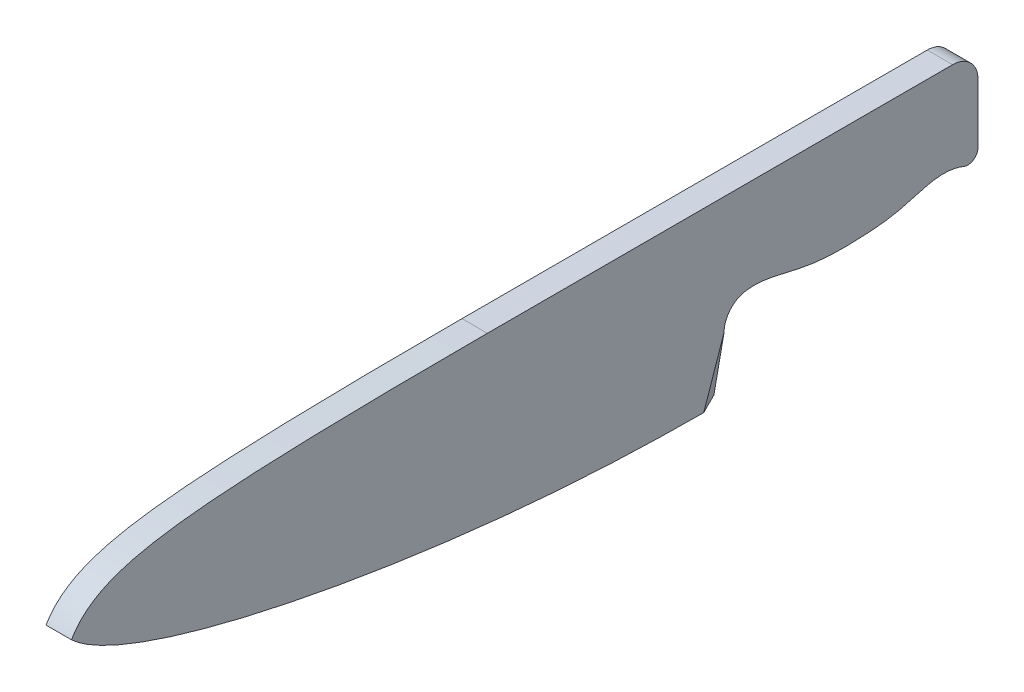
ISO-10303-21;
HEADER;
FILE_DESCRIPTION(('STEP AP214'),'2;1');
FILE_NAME('part.step','',(''),(''),'','','');
FILE_SCHEMA(('AUTOMOTIVE_DESIGN { 1 0 10303 214 1 1 1 1 }'));
ENDSEC;
DATA;
#1=APPLICATION_CONTEXT('core data for automotive mechanical design processes');
#2=APPLICATION_PROTOCOL_DEFINITION('international standard','automotive_design',2000,#1);
#3=PRODUCT_CONTEXT('',#1,'mechanical');
#4=PRODUCT('Part','Part','',(#3));
#5=PRODUCT_RELATED_PRODUCT_CATEGORY('part','',(#4));
#6=PRODUCT_DEFINITION_FORMATION('','',#4);
#7=PRODUCT_DEFINITION_CONTEXT('part definition',#1,'design');
#8=PRODUCT_DEFINITION('design','',#6,#7);
#9=PRODUCT_DEFINITION_SHAPE('','',#8);
#10=(LENGTH_UNIT() NAMED_UNIT(*) SI_UNIT(.MILLI.,.METRE.));
#11=(NAMED_UNIT(*) PLANE_ANGLE_UNIT() SI_UNIT($,.RADIAN.));
#12=(NAMED_UNIT(*) SI_UNIT($,.STERADIAN.) SOLID_ANGLE_UNIT());
#13=UNCERTAINTY_MEASURE_WITH_UNIT(LENGTH_MEASURE(1.E-05),#10,'distance_accuracy_value','');
#14=(GEOMETRIC_REPRESENTATION_CONTEXT(3) GLOBAL_UNCERTAINTY_ASSIGNED_CONTEXT((#13)) GLOBAL_UNIT_ASSIGNED_CONTEXT((#10,
#11,#12)) REPRESENTATION_CONTEXT('',''));
#15=CARTESIAN_POINT('',(0.,0.,0.));
#16=DIRECTION('',(0.,0.,1.));
#17=DIRECTION('',(1.,0.,0.));
#18=AXIS2_PLACEMENT_3D('',#15,#16,#17);
#19=CARTESIAN_POINT('',(0.,0.,0.));
#20=DIRECTION('',(1.,0.,0.));
#21=DIRECTION('',(0.,0.,-1.));
#22=AXIS2_PLACEMENT_3D('',#19,#20,#21);
#23=PLANE('',#22);
#24=DIRECTION('',(0.,0.,-1.));
#25=VECTOR('',#24,1.);
#26=CARTESIAN_POINT('',(0.,-23.2182496890289,0.));
#27=LINE('',#26,#25);
#28=CARTESIAN_POINT('',(0.,-23.2182496890289,-129.97920635635));
#29=VERTEX_POINT('',#28);
#30=CARTESIAN_POINT('',(0.,-23.2182496890289,-130.));
#31=VERTEX_POINT('',#30);
#32=EDGE_CURVE('E133',#29,#31,#27,.T.);
#33=ORIENTED_EDGE('',*,*,#32,.F.);
#34=DIRECTION('',(0.,0.946409710642297,-0.322968511780892));
#35=VECTOR('',#34,1.);
#36=CARTESIAN_POINT('',(0.,-42.151378358654,-123.518152205041));
#37=LINE('',#36,#35);
#38=CARTESIAN_POINT('',(2.74045798044628E-12,-34.8320882912422,-126.015907874488));
#39=VERTEX_POINT('',#38);
#40=EDGE_CURVE('E125',#39,#29,#37,.T.);
#41=ORIENTED_EDGE('',*,*,#40,.F.);
#42=CARTESIAN_POINT('',(0.,-11.3055298771343,-1.49514247137664));
#43=CARTESIAN_POINT('',(0.,-23.9571468302017,-14.8350075186687));
#44=CARTESIAN_POINT('',(0.,-33.8828079248335,-75.5921677527027));
#45=CARTESIAN_POINT('',(0.,-34.8424138846417,-104.343520451848));
#46=CARTESIAN_POINT('',(0.,-34.8424138846417,-130.));
#47=B_SPLINE_CURVE_WITH_KNOTS('',4,(#42,#43,#44,#45,#46),.UNSPECIFIED.,.F.,.F.,(5,5),(0.,1.),.UNSPECIFIED.);
#48=CARTESIAN_POINT('',(0.,-11.3055298771349,-1.49514247137634));
#49=VERTEX_POINT('',#48);
#50=EDGE_CURVE('E167',#49,#39,#47,.T.);
#51=ORIENTED_EDGE('',*,*,#50,.F.);
#52=CARTESIAN_POINT('',(0.,-14.9038464241338,0.));
#53=CARTESIAN_POINT('',(0.,-4.14849373019226,-2.95129566173372));
#54=CARTESIAN_POINT('',(0.,-1.88396672052469,-13.496276671583));
#55=CARTESIAN_POINT('',(0.,0.,-29.5290951403306));
#56=CARTESIAN_POINT('',(0.,0.,-83.4013338124167));
#57=B_SPLINE_CURVE_WITH_KNOTS('',4,(#52,#53,#54,#55,#56),.UNSPECIFIED.,.F.,.F.,(5,5),(0.,1.),.UNSPECIFIED.);
#58=CARTESIAN_POINT('',(0.,0.,-83.4013338124167));
#59=VERTEX_POINT('',#58);
#60=EDGE_CURVE('E175',#49,#59,#57,.T.);
#61=ORIENTED_EDGE('',*,*,#60,.T.);
#62=DIRECTION('',(0.,0.,-1.));
#63=VECTOR('',#62,1.);
#64=CARTESIAN_POINT('',(0.,0.,0.));
#65=LINE('',#64,#63);
#66=CARTESIAN_POINT('',(0.,0.,-175.));
#67=VERTEX_POINT('',#66);
#68=EDGE_CURVE('E340',#59,#67,#65,.T.);
#69=ORIENTED_EDGE('',*,*,#68,.T.);
#70=CARTESIAN_POINT('',(0.,-5.,-175.));
#71=DIRECTION('',(1.,0.,0.));
#72=DIRECTION('',(0.,0.,-1.));
#73=AXIS2_PLACEMENT_3D('',#70,#71,#72);
#74=CIRCLE('',#73,5.);
#75=CARTESIAN_POINT('',(0.,-5.,-180.));
#76=VERTEX_POINT('',#75);
#77=EDGE_CURVE('E233',#67,#76,#74,.F.);
#78=ORIENTED_EDGE('',*,*,#77,.T.);
#79=DIRECTION('',(0.,-1.,0.));
#80=VECTOR('',#79,1.);
#81=CARTESIAN_POINT('',(0.,0.,-180.));
#82=LINE('',#81,#80);
#83=CARTESIAN_POINT('',(0.,-16.6174587646798,-180.));
#84=VERTEX_POINT('',#83);
#85=EDGE_CURVE('E336',#76,#84,#82,.T.);
#86=ORIENTED_EDGE('',*,*,#85,.T.);
#87=CARTESIAN_POINT('',(0.,-16.6174587646798,-178.));
#88=DIRECTION('',(1.,0.,0.));
#89=DIRECTION('',(0.,0.,-1.));
#90=AXIS2_PLACEMENT_3D('',#87,#88,#89);
#91=CIRCLE('',#90,2.);
#92=CARTESIAN_POINT('',(0.,-18.4712177868793,-177.249282018589));
#93=VERTEX_POINT('',#92);
#94=EDGE_CURVE('E215',#84,#93,#91,.F.);
#95=ORIENTED_EDGE('',*,*,#94,.T.);
#96=CARTESIAN_POINT('',(0.,-20.,-130.));
#97=CARTESIAN_POINT('',(0.,-11.053747081909,-142.55496439757));
#98=CARTESIAN_POINT('',(0.,-34.9341755237242,-149.196912903773));
#99=CARTESIAN_POINT('',(0.,-5.37325526441555,-158.630756241077));
#100=CARTESIAN_POINT('',(0.,-33.9367404981705,-163.289648634566));
#101=CARTESIAN_POINT('',(0.,-10.14486839111,-166.072200521993));
#102=CARTESIAN_POINT('',(0.,-20.,-180.));
#103=B_SPLINE_CURVE_WITH_KNOTS('',6,(#96,#97,#98,#99,#100,#101,#102),.UNSPECIFIED.,.F.,.F.,(7,
7),(0.,1.),.UNSPECIFIED.);
#104=CARTESIAN_POINT('',(0.,-18.2291901749905,-134.155272250673));
#105=VERTEX_POINT('',#104);
#106=EDGE_CURVE('E332',#105,#93,#103,.T.);
#107=ORIENTED_EDGE('',*,*,#106,.F.);
#108=CARTESIAN_POINT('',(0.,-23.1573171041104,-135.));
#109=DIRECTION('',(1.,0.,0.));
#110=DIRECTION('',(0.,0.,-1.));
#111=AXIS2_PLACEMENT_3D('',#108,#109,#110);
#112=CIRCLE('',#111,5.);
#113=CARTESIAN_POINT('',(0.,-23.1573171041104,-130.));
#114=VERTEX_POINT('',#113);
#115=EDGE_CURVE('E208',#105,#114,#112,.T.);
#116=ORIENTED_EDGE('',*,*,#115,.T.);
#117=DIRECTION('',(0.,-1.,0.));
#118=VECTOR('',#117,1.);
#119=CARTESIAN_POINT('',(0.,0.,-130.));
#120=LINE('',#119,#118);
#121=EDGE_CURVE('E140',#114,#31,#120,.T.);
#122=ORIENTED_EDGE('',*,*,#121,.T.);
#123=EDGE_LOOP('',(#33,#41,#51,#61,#69,#78,#86,#95,#107,#116,#122));
#124=FACE_BOUND('',#123,.T.);
#125=ADVANCED_FACE('F40',(#124),#23,.F.);
#126=CARTESIAN_POINT('',(5.,0.,-130.));
#127=DIRECTION('',(0.,0.,-1.));
#128=DIRECTION('',(-1.,0.,0.));
#129=AXIS2_PLACEMENT_3D('',#126,#127,#128);
#130=PLANE('',#129);
#131=DIRECTION('',(-0.166223849992716,0.986088044595207,0.));
#132=VECTOR('',#131,1.);
#133=CARTESIAN_POINT('',(-3.65759529527161,-1.45940195659671,-130.));
#134=LINE('',#133,#132);
#135=CARTESIAN_POINT('',(1.96974477587823,-34.8424138846417,-130.));
#136=VERTEX_POINT('',#135);
#137=CARTESIAN_POINT('',(0.00998754232635801,-23.2165660992657,-130.));
#138=VERTEX_POINT('',#137);
#139=EDGE_CURVE('E55',#136,#138,#134,.T.);
#140=ORIENTED_EDGE('',*,*,#139,.T.);
#141=DIRECTION('',(-0.986088044595207,-0.166223849992717,0.));
#142=VECTOR('',#141,1.);
#143=CARTESIAN_POINT('',(8.66758283759797,-21.757164142669,-130.));
#144=LINE('',#143,#142);
#145=EDGE_CURVE('E11',#138,#31,#144,.T.);
#146=ORIENTED_EDGE('',*,*,#145,.T.);
#147=ORIENTED_EDGE('',*,*,#121,.F.);
#148=DIRECTION('',(-1.,0.,0.));
#149=VECTOR('',#148,1.);
#150=CARTESIAN_POINT('',(5.,-23.1573171041104,-130.));
#151=LINE('',#150,#149);
#152=CARTESIAN_POINT('',(4.99999991539885,-23.1573353290078,-129.999996850267));
#153=VERTEX_POINT('',#152);
#154=EDGE_CURVE('E189',#114,#153,#151,.F.);
#155=ORIENTED_EDGE('',*,*,#154,.T.);
#156=DIRECTION('',(0.168722955180373,0.985663514793564,0.));
#157=VECTOR('',#156,1.);
#158=CARTESIAN_POINT('',(8.85115587696016,-0.659229433441154,-130.));
#159=LINE('',#158,#157);
#160=CARTESIAN_POINT('',(2.99977981249231,-34.8424138846417,-130.));
#161=VERTEX_POINT('',#160);
#162=EDGE_CURVE('E141',#161,#153,#159,.T.);
#163=ORIENTED_EDGE('',*,*,#162,.F.);
#164=DIRECTION('',(1.,0.,0.));
#165=VECTOR('',#164,1.);
#166=CARTESIAN_POINT('',(0.,-34.8424138846417,-130.));
#167=LINE('',#166,#165);
#168=EDGE_CURVE('E170',#161,#136,#167,.F.);
#169=ORIENTED_EDGE('',*,*,#168,.T.);
#170=EDGE_LOOP('',(#140,#146,#147,#155,#163,#169));
#171=FACE_BOUND('',#170,.T.);
#172=ADVANCED_FACE('F260',(#171),#130,.T.);
#173=DIRECTION('',(1.,0.,0.));
#174=VECTOR('',#173,1.);
#175=SURFACE_OF_LINEAR_EXTRUSION('',#47,#174);
#176=ORIENTED_EDGE('',*,*,#50,.T.);
#177=CARTESIAN_POINT('',(2.74045798044628E-12,-34.8320882912422,-126.015907874488));
#178=CARTESIAN_POINT('',(0.164278119276692,-34.8339378553204,-126.347846700765));
#179=CARTESIAN_POINT('',(0.32851916686541,-34.8355094181573,-126.679805347657));
#180=CARTESIAN_POINT('',(0.656932642337356,-34.838141982821,-127.343757957752));
#181=CARTESIAN_POINT('',(0.821105070330034,-34.8392029854652,-127.675751920899));
#182=CARTESIAN_POINT('',(1.14938734271228,-34.8408598767794,-128.339771874087));
#183=CARTESIAN_POINT('',(1.31349718710703,-34.8414557654878,-128.671797864125));
#184=CARTESIAN_POINT('',(1.64166117318842,-34.8422330453791,-129.335878527812));
#185=CARTESIAN_POINT('',(1.80571531478545,-34.8424144358982,-129.667933201505));
#186=CARTESIAN_POINT('',(1.96974477587823,-34.8424138846417,-130.));
#187=B_SPLINE_CURVE_WITH_KNOTS('',3,(#177,#178,#179,#180,#181,#182,#183,#184,#185,#186),
.UNSPECIFIED.,.F.,.F.,(4,2,2,2,4),(0.,1.11111048107723,2.22221918309331,3.33332779307961,
4.44443818212724),.UNSPECIFIED.);
#188=EDGE_CURVE('E48',#39,#136,#187,.T.);
#189=ORIENTED_EDGE('',*,*,#188,.T.);
#190=ORIENTED_EDGE('',*,*,#168,.F.);
#191=CARTESIAN_POINT('',(5.03001207199706,-34.8316605732864,-125.939989884659));
#192=CARTESIAN_POINT('',(4.86068610425115,-34.8335885495604,-126.27825063095));
#193=CARTESIAN_POINT('',(4.69139926723171,-34.835226165049,-126.616532538806));
#194=CARTESIAN_POINT('',(4.35289797670323,-34.8379685650899,-127.293134034286));
#195=CARTESIAN_POINT('',(4.18368352307385,-34.8390733505316,-127.631453621845));
#196=CARTESIAN_POINT('',(3.84532057098216,-34.8407979871538,-128.308126932978));
#197=CARTESIAN_POINT('',(3.67617207251408,-34.8414178383768,-128.646480656547));
#198=CARTESIAN_POINT('',(3.33793368095026,-34.8422260850787,-129.323218627831));
#199=CARTESIAN_POINT('',(3.16884378795281,-34.8424144798374,-129.661602875596));
#200=CARTESIAN_POINT('',(2.9997798124923,-34.8424138846417,-130.));
#201=B_SPLINE_CURVE_WITH_KNOTS('',3,(#191,#192,#193,#194,#195,#196,#197,#198,#199,#200),
.UNSPECIFIED.,.F.,.F.,(4,2,2,2,4),(0.,1.1348380953435,2.26967429658376,3.4045103986451,
4.53934839480983),.UNSPECIFIED.);
#202=CARTESIAN_POINT('',(5.,-34.8319991651759,-125.999945765339));
#203=VERTEX_POINT('',#202);
#204=EDGE_CURVE('E180',#203,#161,#201,.T.);
#205=ORIENTED_EDGE('',*,*,#204,.F.);
#206=CARTESIAN_POINT('',(5.,-11.3055435719602,-1.49515691122323));
#207=CARTESIAN_POINT('',(5.,-23.9571548882732,-14.8350568439062));
#208=CARTESIAN_POINT('',(5.,-33.8828084441994,-75.5921833137491));
#209=CARTESIAN_POINT('',(5.,-34.8424138846417,-104.343527394855));
#210=CARTESIAN_POINT('',(5.,-34.8424138846417,-130.));
#211=B_SPLINE_CURVE_WITH_KNOTS('',4,(#206,#207,#208,#209,#210),.UNSPECIFIED.,.F.,.F.,(5,5),
(2.70614164820354E-07,1.),.UNSPECIFIED.);
#212=CARTESIAN_POINT('',(5.00000119031637,-11.3055465844291,-1.49515405418635));
#213=VERTEX_POINT('',#212);
#214=EDGE_CURVE('E172',#213,#203,#211,.T.);
#215=ORIENTED_EDGE('',*,*,#214,.F.);
#216=DIRECTION('',(1.,0.,0.));
#217=VECTOR('',#216,1.);
#218=CARTESIAN_POINT('',(0.,-11.3055298771349,-1.49514247137634));
#219=LINE('',#218,#217);
#220=EDGE_CURVE('E155',#49,#213,#219,.T.);
#221=ORIENTED_EDGE('',*,*,#220,.F.);
#222=EDGE_LOOP('',(#176,#189,#190,#205,#215,#221));
#223=FACE_BOUND('',#222,.T.);
#224=ADVANCED_FACE('F162',(#223),#175,.T.);
#225=CARTESIAN_POINT('',(5.,-14.9038464241338,0.));
#226=CARTESIAN_POINT('',(5.,-4.14849373019226,-2.95129566173372));
#227=CARTESIAN_POINT('',(5.,-1.88396672052469,-13.496276671583));
#228=CARTESIAN_POINT('',(5.,0.,-29.5290951403306));
#229=CARTESIAN_POINT('',(5.,0.,-83.4013338124167));
#230=B_SPLINE_CURVE_WITH_KNOTS('',4,(#225,#226,#227,#228,#229),.UNSPECIFIED.,.F.,.F.,(5,5),(0.,
1.),.UNSPECIFIED.);
#231=DIRECTION('',(-1.,0.,0.));
#232=VECTOR('',#231,1.);
#233=SURFACE_OF_LINEAR_EXTRUSION('',#230,#232);
#234=ORIENTED_EDGE('',*,*,#60,.F.);
#235=ORIENTED_EDGE('',*,*,#220,.T.);
#236=CARTESIAN_POINT('',(5.,-11.305538030755,-1.49513767191239));
#237=CARTESIAN_POINT('',(5.,-3.5253808358954,-6.07476644342907));
#238=CARTESIAN_POINT('',(5.,-1.54859315176791,-16.8199668455277));
#239=CARTESIAN_POINT('',(5.,0.,-34.5589247184904));
#240=CARTESIAN_POINT('',(5.,0.,-83.4013338124167));
#241=B_SPLINE_CURVE_WITH_KNOTS('',4,(#236,#237,#238,#239,#240),.UNSPECIFIED.,.F.,.F.,(5,5),
(0.0933658912668503,1.),.UNSPECIFIED.);
#242=CARTESIAN_POINT('',(5.,0.,-83.4013338124167));
#243=VERTEX_POINT('',#242);
#244=EDGE_CURVE('E277',#213,#243,#241,.T.);
#245=ORIENTED_EDGE('',*,*,#244,.T.);
#246=DIRECTION('',(-1.,0.,0.));
#247=VECTOR('',#246,1.);
#248=CARTESIAN_POINT('',(5.,0.,-83.4013338124167));
#249=LINE('',#248,#247);
#250=EDGE_CURVE('E311',#243,#59,#249,.T.);
#251=ORIENTED_EDGE('',*,*,#250,.T.);
#252=EDGE_LOOP('',(#234,#235,#245,#251));
#253=FACE_BOUND('',#252,.T.);
#254=ADVANCED_FACE('F247',(#253),#233,.T.);
#255=CARTESIAN_POINT('',(5.,0.,0.));
#256=DIRECTION('',(1.,0.,0.));
#257=DIRECTION('',(0.,0.,-1.));
#258=AXIS2_PLACEMENT_3D('',#255,#256,#257);
#259=PLANE('',#258);
#260=DIRECTION('',(0.,-0.946012895640181,0.32412898864878));
#261=VECTOR('',#260,1.);
#262=CARTESIAN_POINT('',(5.,-42.294824906362,-123.442984680453));
#263=LINE('',#262,#261);
#264=EDGE_CURVE('E63',#153,#203,#263,.T.);
#265=ORIENTED_EDGE('',*,*,#264,.F.);
#266=CARTESIAN_POINT('',(5.,-23.1573171041104,-135.));
#267=DIRECTION('',(1.,0.,0.));
#268=DIRECTION('',(0.,0.,-1.));
#269=AXIS2_PLACEMENT_3D('',#266,#267,#268);
#270=CIRCLE('',#269,5.);
#271=CARTESIAN_POINT('',(5.,-18.2291901749905,-134.155272250673));
#272=VERTEX_POINT('',#271);
#273=EDGE_CURVE('E206',#153,#272,#270,.F.);
#274=ORIENTED_EDGE('',*,*,#273,.T.);
#275=CARTESIAN_POINT('',(5.,-20.,-130.));
#276=CARTESIAN_POINT('',(5.,-11.053747081909,-142.55496439757));
#277=CARTESIAN_POINT('',(5.,-34.9341755237242,-149.196912903773));
#278=CARTESIAN_POINT('',(5.,-5.37325526441555,-158.630756241077));
#279=CARTESIAN_POINT('',(5.,-33.9367404981705,-163.289648634566));
#280=CARTESIAN_POINT('',(5.,-10.14486839111,-166.072200521993));
#281=CARTESIAN_POINT('',(5.,-20.,-180.));
#282=B_SPLINE_CURVE_WITH_KNOTS('',6,(#275,#276,#277,#278,#279,#280,#281),.UNSPECIFIED.,.F.,.F.,
(7,7),(0.,1.),.UNSPECIFIED.);
#283=CARTESIAN_POINT('',(5.,-18.4712177868793,-177.249282018589));
#284=VERTEX_POINT('',#283);
#285=EDGE_CURVE('E268',#272,#284,#282,.T.);
#286=ORIENTED_EDGE('',*,*,#285,.T.);
#287=CARTESIAN_POINT('',(5.,-16.6174587646798,-178.));
#288=DIRECTION('',(1.,0.,0.));
#289=DIRECTION('',(0.,0.,-1.));
#290=AXIS2_PLACEMENT_3D('',#287,#288,#289);
#291=CIRCLE('',#290,2.);
#292=CARTESIAN_POINT('',(5.,-16.6174587646798,-180.));
#293=VERTEX_POINT('',#292);
#294=EDGE_CURVE('E227',#284,#293,#291,.T.);
#295=ORIENTED_EDGE('',*,*,#294,.T.);
#296=DIRECTION('',(0.,-1.,0.));
#297=VECTOR('',#296,1.);
#298=CARTESIAN_POINT('',(5.,0.,-180.));
#299=LINE('',#298,#297);
#300=CARTESIAN_POINT('',(5.,-5.,-180.));
#301=VERTEX_POINT('',#300);
#302=EDGE_CURVE('E276',#301,#293,#299,.T.);
#303=ORIENTED_EDGE('',*,*,#302,.F.);
#304=CARTESIAN_POINT('',(5.,-5.,-175.));
#305=DIRECTION('',(1.,0.,0.));
#306=DIRECTION('',(0.,0.,-1.));
#307=AXIS2_PLACEMENT_3D('',#304,#305,#306);
#308=CIRCLE('',#307,5.);
#309=CARTESIAN_POINT('',(5.,0.,-175.));
#310=VERTEX_POINT('',#309);
#311=EDGE_CURVE('E237',#301,#310,#308,.T.);
#312=ORIENTED_EDGE('',*,*,#311,.T.);
#313=DIRECTION('',(0.,0.,-1.));
#314=VECTOR('',#313,1.);
#315=CARTESIAN_POINT('',(5.,0.,0.));
#316=LINE('',#315,#314);
#317=EDGE_CURVE('E313',#243,#310,#316,.T.);
#318=ORIENTED_EDGE('',*,*,#317,.F.);
#319=ORIENTED_EDGE('',*,*,#244,.F.);
#320=ORIENTED_EDGE('',*,*,#214,.T.);
#321=EDGE_LOOP('',(#265,#274,#286,#295,#303,#312,#318,#319,#320));
#322=FACE_BOUND('',#321,.T.);
#323=ADVANCED_FACE('F258',(#322),#259,.T.);
#324=DIRECTION('',(-1.,0.,0.));
#325=VECTOR('',#324,1.);
#326=SURFACE_OF_LINEAR_EXTRUSION('',#282,#325);
#327=ORIENTED_EDGE('',*,*,#106,.T.);
#328=DIRECTION('',(-1.,0.,0.));
#329=VECTOR('',#328,1.);
#330=CARTESIAN_POINT('',(0.,-18.4712177868793,-177.249282018589));
#331=LINE('',#330,#329);
#332=EDGE_CURVE('E225',#93,#284,#331,.F.);
#333=ORIENTED_EDGE('',*,*,#332,.T.);
#334=ORIENTED_EDGE('',*,*,#285,.F.);
#335=DIRECTION('',(-1.,0.,0.));
#336=VECTOR('',#335,1.);
#337=CARTESIAN_POINT('',(5.,-18.2291901749905,-134.155272250673));
#338=LINE('',#337,#336);
#339=EDGE_CURVE('E220',#272,#105,#338,.T.);
#340=ORIENTED_EDGE('',*,*,#339,.T.);
#341=EDGE_LOOP('',(#327,#333,#334,#340));
#342=FACE_BOUND('',#341,.T.);
#343=ADVANCED_FACE('F282',(#342),#326,.F.);
#344=CARTESIAN_POINT('',(5.,0.,-180.));
#345=DIRECTION('',(0.,0.,-1.));
#346=DIRECTION('',(-1.,0.,0.));
#347=AXIS2_PLACEMENT_3D('',#344,#345,#346);
#348=PLANE('',#347);
#349=ORIENTED_EDGE('',*,*,#85,.F.);
#350=DIRECTION('',(-1.,0.,0.));
#351=VECTOR('',#350,1.);
#352=CARTESIAN_POINT('',(5.,-5.,-180.));
#353=LINE('',#352,#351);
#354=EDGE_CURVE('E235',#76,#301,#353,.F.);
#355=ORIENTED_EDGE('',*,*,#354,.T.);
#356=ORIENTED_EDGE('',*,*,#302,.T.);
#357=DIRECTION('',(1.,0.,0.));
#358=VECTOR('',#357,1.);
#359=CARTESIAN_POINT('',(0.,-16.6174587646798,-180.));
#360=LINE('',#359,#358);
#361=EDGE_CURVE('E207',#293,#84,#360,.F.);
#362=ORIENTED_EDGE('',*,*,#361,.T.);
#363=EDGE_LOOP('',(#349,#355,#356,#362));
#364=FACE_BOUND('',#363,.T.);
#365=ADVANCED_FACE('F285',(#364),#348,.T.);
#366=CARTESIAN_POINT('',(5.,0.,0.));
#367=DIRECTION('',(0.,1.,0.));
#368=DIRECTION('',(0.,0.,1.));
#369=AXIS2_PLACEMENT_3D('',#366,#367,#368);
#370=PLANE('',#369);
#371=ORIENTED_EDGE('',*,*,#317,.T.);
#372=DIRECTION('',(-1.,0.,0.));
#373=VECTOR('',#372,1.);
#374=CARTESIAN_POINT('',(5.,0.,-175.));
#375=LINE('',#374,#373);
#376=EDGE_CURVE('E230',#310,#67,#375,.T.);
#377=ORIENTED_EDGE('',*,*,#376,.T.);
#378=ORIENTED_EDGE('',*,*,#68,.F.);
#379=ORIENTED_EDGE('',*,*,#250,.F.);
#380=EDGE_LOOP('',(#371,#377,#378,#379));
#381=FACE_BOUND('',#380,.T.);
#382=ADVANCED_FACE('F289',(#381),#370,.T.);
#383=CARTESIAN_POINT('',(2.5,-23.1573171041104,-135.));
#384=DIRECTION('',(-1.,0.,0.));
#385=DIRECTION('',(0.,0.,1.));
#386=AXIS2_PLACEMENT_3D('',#383,#384,#385);
#387=CYLINDRICAL_SURFACE('',#386,5.);
#388=ORIENTED_EDGE('',*,*,#273,.F.);
#389=ORIENTED_EDGE('',*,*,#154,.F.);
#390=ORIENTED_EDGE('',*,*,#115,.F.);
#391=ORIENTED_EDGE('',*,*,#339,.F.);
#392=EDGE_LOOP('',(#388,#389,#390,#391));
#393=FACE_BOUND('',#392,.T.);
#394=ADVANCED_FACE('F262',(#393),#387,.F.);
#395=CARTESIAN_POINT('',(2.5,-16.6174587646798,-178.));
#396=DIRECTION('',(-1.,0.,0.));
#397=DIRECTION('',(0.,0.,1.));
#398=AXIS2_PLACEMENT_3D('',#395,#396,#397);
#399=CYLINDRICAL_SURFACE('',#398,2.);
#400=ORIENTED_EDGE('',*,*,#294,.F.);
#401=ORIENTED_EDGE('',*,*,#332,.F.);
#402=ORIENTED_EDGE('',*,*,#94,.F.);
#403=ORIENTED_EDGE('',*,*,#361,.F.);
#404=EDGE_LOOP('',(#400,#401,#402,#403));
#405=FACE_BOUND('',#404,.T.);
#406=ADVANCED_FACE('F354',(#405),#399,.T.);
#407=CARTESIAN_POINT('',(5.,-5.,-175.));
#408=DIRECTION('',(-1.,0.,0.));
#409=DIRECTION('',(0.,0.,1.));
#410=AXIS2_PLACEMENT_3D('',#407,#408,#409);
#411=CYLINDRICAL_SURFACE('',#410,5.);
#412=ORIENTED_EDGE('',*,*,#311,.F.);
#413=ORIENTED_EDGE('',*,*,#354,.F.);
#414=ORIENTED_EDGE('',*,*,#77,.F.);
#415=ORIENTED_EDGE('',*,*,#376,.F.);
#416=EDGE_LOOP('',(#412,#413,#414,#415));
#417=FACE_BOUND('',#416,.T.);
#418=ADVANCED_FACE('F42',(#417),#411,.T.);
#419=CARTESIAN_POINT('',(57.7934843031797,-9.89291712176767,-28.8737740234423));
#420=DIRECTION('',(-0.88426202268349,0.151365348703385,0.441779590352028));
#421=DIRECTION('',(0.446929159049718,0.,0.894569352700567));
#422=AXIS2_PLACEMENT_3D('',#419,#420,#421);
#423=PLANE('',#422);
#424=ORIENTED_EDGE('',*,*,#264,.T.);
#425=ORIENTED_EDGE('',*,*,#204,.T.);
#426=ORIENTED_EDGE('',*,*,#162,.T.);
#427=EDGE_LOOP('',(#424,#425,#426));
#428=FACE_BOUND('',#427,.T.);
#429=ADVANCED_FACE('F191',(#428),#423,.F.);
#430=CARTESIAN_POINT('',(-5.45926686662574,-24.1385127037587,-172.60600208295));
#431=DIRECTION('',(0.166223849992717,-0.986088044595207,0.));
#432=DIRECTION('',(0.986088044595207,0.166223849992717,0.));
#433=AXIS2_PLACEMENT_3D('',#430,#431,#432);
#434=PLANE('',#433);
#435=ORIENTED_EDGE('',*,*,#32,.T.);
#436=ORIENTED_EDGE('',*,*,#145,.F.);
#437=DIRECTION('',(0.431814810985906,0.0727905796641309,-0.899020300396696));
#438=VECTOR('',#437,1.);
#439=CARTESIAN_POINT('',(15.5012776912736,-20.6052152122673,-162.252215461163));
#440=LINE('',#439,#438);
#441=EDGE_CURVE('E128',#29,#138,#440,.T.);
#442=ORIENTED_EDGE('',*,*,#441,.F.);
#443=EDGE_LOOP('',(#435,#436,#442));
#444=FACE_BOUND('',#443,.T.);
#445=ADVANCED_FACE('F136',(#444),#434,.T.);
#446=CARTESIAN_POINT('',(-53.5352017199544,-9.02437402907618,-26.4445445981435));
#447=DIRECTION('',(-0.886513170069574,-0.149438615553547,-0.437906952987314));
#448=DIRECTION('',(-0.442880050897423,0.,0.896580872268138));
#449=AXIS2_PLACEMENT_3D('',#446,#447,#448);
#450=PLANE('',#449);
#451=ORIENTED_EDGE('',*,*,#40,.T.);
#452=ORIENTED_EDGE('',*,*,#441,.T.);
#453=ORIENTED_EDGE('',*,*,#139,.F.);
#454=ORIENTED_EDGE('',*,*,#188,.F.);
#455=EDGE_LOOP('',(#451,#452,#453,#454));
#456=FACE_BOUND('',#455,.T.);
#457=ADVANCED_FACE('F127',(#456),#450,.T.);
#458=CLOSED_SHELL('',(#125,#172,#224,#254,#323,#343,#365,#382,#394,#406,#418,#429,#445,#457));
#459=MANIFOLD_SOLID_BREP('B2',#458);
#460=ADVANCED_BREP_SHAPE_REPRESENTATION('',(#18,#459),#14);
#461=SHAPE_DEFINITION_REPRESENTATION(#9,#460);
ENDSEC;
END-ISO-10303-21;
